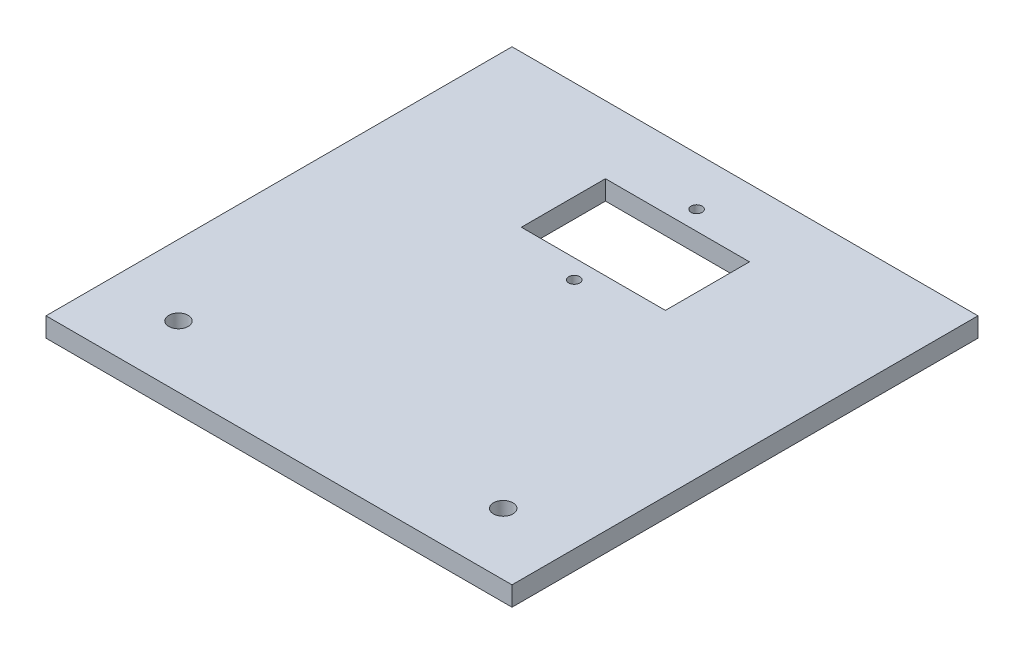
ISO-10303-21;
HEADER;
FILE_DESCRIPTION(('STEP AP214'),'2;1');
FILE_NAME('part.step','',(''),(''),'','','');
FILE_SCHEMA(('AUTOMOTIVE_DESIGN { 1 0 10303 214 1 1 1 1 }'));
ENDSEC;
DATA;
#1=APPLICATION_CONTEXT('core data for automotive mechanical design processes');
#2=APPLICATION_PROTOCOL_DEFINITION('international standard','automotive_design',2000,#1);
#3=PRODUCT_CONTEXT('',#1,'mechanical');
#4=PRODUCT('Part','Part','',(#3));
#5=PRODUCT_RELATED_PRODUCT_CATEGORY('part','',(#4));
#6=PRODUCT_DEFINITION_FORMATION('','',#4);
#7=PRODUCT_DEFINITION_CONTEXT('part definition',#1,'design');
#8=PRODUCT_DEFINITION('design','',#6,#7);
#9=PRODUCT_DEFINITION_SHAPE('','',#8);
#10=(LENGTH_UNIT() NAMED_UNIT(*) SI_UNIT(.MILLI.,.METRE.));
#11=(NAMED_UNIT(*) PLANE_ANGLE_UNIT() SI_UNIT($,.RADIAN.));
#12=(NAMED_UNIT(*) SI_UNIT($,.STERADIAN.) SOLID_ANGLE_UNIT());
#13=UNCERTAINTY_MEASURE_WITH_UNIT(LENGTH_MEASURE(1.E-05),#10,'distance_accuracy_value','');
#14=(GEOMETRIC_REPRESENTATION_CONTEXT(3) GLOBAL_UNCERTAINTY_ASSIGNED_CONTEXT((#13)) GLOBAL_UNIT_ASSIGNED_CONTEXT((#10,
#11,#12)) REPRESENTATION_CONTEXT('',''));
#15=CARTESIAN_POINT('',(0.,0.,0.));
#16=DIRECTION('',(0.,0.,1.));
#17=DIRECTION('',(1.,0.,0.));
#18=AXIS2_PLACEMENT_3D('',#15,#16,#17);
#19=CARTESIAN_POINT('',(0.,3.175,0.));
#20=DIRECTION('',(0.,-1.,0.));
#21=DIRECTION('',(0.,0.,-1.));
#22=AXIS2_PLACEMENT_3D('',#19,#20,#21);
#23=PLANE('',#22);
#24=CARTESIAN_POINT('',(-53.096867931118,3.175,55.9809871297665));
#25=DIRECTION('',(0.,-1.,0.));
#26=DIRECTION('',(0.,0.,-1.));
#27=AXIS2_PLACEMENT_3D('',#24,#25,#26);
#28=CIRCLE('',#27,3.17500000000003);
#29=CARTESIAN_POINT('',(-53.096867931118,3.175,52.8059871297664));
#30=VERTEX_POINT('',#29);
#31=EDGE_CURVE('E226',#30,#30,#28,.T.);
#32=ORIENTED_EDGE('',*,*,#31,.T.);
#33=EDGE_LOOP('',(#32));
#34=FACE_BOUND('',#33,.T.);
#35=CARTESIAN_POINT('',(53.096867931118,3.175,55.9809871297665));
#36=DIRECTION('',(0.,-1.,0.));
#37=DIRECTION('',(0.,0.,-1.));
#38=AXIS2_PLACEMENT_3D('',#35,#36,#37);
#39=CIRCLE('',#38,3.17500000000003);
#40=CARTESIAN_POINT('',(53.096867931118,3.175,52.8059871297664));
#41=VERTEX_POINT('',#40);
#42=EDGE_CURVE('E216',#41,#41,#39,.T.);
#43=ORIENTED_EDGE('',*,*,#42,.T.);
#44=EDGE_LOOP('',(#43));
#45=FACE_BOUND('',#44,.T.);
#46=CARTESIAN_POINT('',(0.,3.175,-60.3611469920994));
#47=DIRECTION('',(0.,1.,0.));
#48=DIRECTION('',(0.,0.,1.));
#49=AXIS2_PLACEMENT_3D('',#46,#47,#48);
#50=CIRCLE('',#49,1.8);
#51=CARTESIAN_POINT('',(0.,3.175,-58.5611469920994));
#52=VERTEX_POINT('',#51);
#53=EDGE_CURVE('E137',#52,#52,#50,.T.);
#54=ORIENTED_EDGE('',*,*,#53,.F.);
#55=EDGE_LOOP('',(#54));
#56=FACE_BOUND('',#55,.T.);
#57=DIRECTION('',(0.,0.,-1.));
#58=VECTOR('',#57,1.);
#59=CARTESIAN_POINT('',(76.2,3.175,76.2));
#60=LINE('',#59,#58);
#61=CARTESIAN_POINT('',(76.2,3.175,76.2));
#62=VERTEX_POINT('',#61);
#63=CARTESIAN_POINT('',(76.2,3.175,-76.2));
#64=VERTEX_POINT('',#63);
#65=EDGE_CURVE('E156',#62,#64,#60,.T.);
#66=ORIENTED_EDGE('',*,*,#65,.T.);
#67=DIRECTION('',(-1.,0.,0.));
#68=VECTOR('',#67,1.);
#69=CARTESIAN_POINT('',(-76.2,3.175,-76.2));
#70=LINE('',#69,#68);
#71=CARTESIAN_POINT('',(-76.2,3.175,-76.2));
#72=VERTEX_POINT('',#71);
#73=EDGE_CURVE('E160',#64,#72,#70,.T.);
#74=ORIENTED_EDGE('',*,*,#73,.T.);
#75=DIRECTION('',(0.,0.,1.));
#76=VECTOR('',#75,1.);
#77=CARTESIAN_POINT('',(-76.2,3.175,76.2));
#78=LINE('',#77,#76);
#79=CARTESIAN_POINT('',(-76.2,3.175,76.2));
#80=VERTEX_POINT('',#79);
#81=EDGE_CURVE('E164',#72,#80,#78,.T.);
#82=ORIENTED_EDGE('',*,*,#81,.T.);
#83=DIRECTION('',(1.,0.,0.));
#84=VECTOR('',#83,1.);
#85=CARTESIAN_POINT('',(-76.2,3.175,76.2));
#86=LINE('',#85,#84);
#87=EDGE_CURVE('E167',#80,#62,#86,.T.);
#88=ORIENTED_EDGE('',*,*,#87,.T.);
#89=EDGE_LOOP('',(#66,#74,#82,#88));
#90=FACE_BOUND('',#89,.T.);
#91=DIRECTION('',(-1.,0.,0.));
#92=VECTOR('',#91,1.);
#93=CARTESIAN_POINT('',(23.55,3.175,-26.6111469920994));
#94=LINE('',#93,#92);
#95=CARTESIAN_POINT('',(23.55,3.175,-26.6111469920994));
#96=VERTEX_POINT('',#95);
#97=CARTESIAN_POINT('',(-23.55,3.175,-26.6111469920994));
#98=VERTEX_POINT('',#97);
#99=EDGE_CURVE('E65',#96,#98,#94,.T.);
#100=ORIENTED_EDGE('',*,*,#99,.T.);
#101=DIRECTION('',(0.,0.,1.));
#102=VECTOR('',#101,1.);
#103=CARTESIAN_POINT('',(-23.55,3.175,-54.1111469920994));
#104=LINE('',#103,#102);
#105=CARTESIAN_POINT('',(-23.55,3.175,-54.1111469920994));
#106=VERTEX_POINT('',#105);
#107=EDGE_CURVE('E124',#106,#98,#104,.T.);
#108=ORIENTED_EDGE('',*,*,#107,.F.);
#109=DIRECTION('',(-1.,0.,0.));
#110=VECTOR('',#109,1.);
#111=CARTESIAN_POINT('',(23.55,3.175,-54.1111469920994));
#112=LINE('',#111,#110);
#113=CARTESIAN_POINT('',(23.55,3.175,-54.1111469920994));
#114=VERTEX_POINT('',#113);
#115=EDGE_CURVE('E131',#114,#106,#112,.T.);
#116=ORIENTED_EDGE('',*,*,#115,.F.);
#117=DIRECTION('',(0.,0.,1.));
#118=VECTOR('',#117,1.);
#119=CARTESIAN_POINT('',(23.55,3.175,-54.1111469920994));
#120=LINE('',#119,#118);
#121=EDGE_CURVE('E135',#114,#96,#120,.T.);
#122=ORIENTED_EDGE('',*,*,#121,.T.);
#123=EDGE_LOOP('',(#100,#108,#116,#122));
#124=FACE_BOUND('',#123,.T.);
#125=CARTESIAN_POINT('',(0.,3.175,-20.3611469920994));
#126=DIRECTION('',(0.,-1.,0.));
#127=DIRECTION('',(0.,0.,-1.));
#128=AXIS2_PLACEMENT_3D('',#125,#126,#127);
#129=CIRCLE('',#128,1.8);
#130=CARTESIAN_POINT('',(0.,3.175,-22.1611469920994));
#131=VERTEX_POINT('',#130);
#132=EDGE_CURVE('E141',#131,#131,#129,.T.);
#133=ORIENTED_EDGE('',*,*,#132,.T.);
#134=EDGE_LOOP('',(#133));
#135=FACE_BOUND('',#134,.T.);
#136=ADVANCED_FACE('F47',(#34,#45,#56,#90,#124,#135),#23,.F.);
#137=CARTESIAN_POINT('',(0.,-3.175,0.));
#138=DIRECTION('',(0.,-1.,0.));
#139=DIRECTION('',(0.,0.,-1.));
#140=AXIS2_PLACEMENT_3D('',#137,#138,#139);
#141=PLANE('',#140);
#142=CARTESIAN_POINT('',(-53.096867931118,-3.175,55.9809871297665));
#143=DIRECTION('',(0.,-1.,0.));
#144=DIRECTION('',(0.,0.,-1.));
#145=AXIS2_PLACEMENT_3D('',#142,#143,#144);
#146=CIRCLE('',#145,3.17500000000003);
#147=CARTESIAN_POINT('',(-53.096867931118,-3.175,52.8059871297664));
#148=VERTEX_POINT('',#147);
#149=EDGE_CURVE('E51',#148,#148,#146,.T.);
#150=ORIENTED_EDGE('',*,*,#149,.F.);
#151=EDGE_LOOP('',(#150));
#152=FACE_BOUND('',#151,.T.);
#153=CARTESIAN_POINT('',(53.096867931118,-3.175,55.9809871297665));
#154=DIRECTION('',(0.,-1.,0.));
#155=DIRECTION('',(0.,0.,-1.));
#156=AXIS2_PLACEMENT_3D('',#153,#154,#155);
#157=CIRCLE('',#156,3.17500000000003);
#158=CARTESIAN_POINT('',(53.096867931118,-3.175,52.8059871297664));
#159=VERTEX_POINT('',#158);
#160=EDGE_CURVE('E213',#159,#159,#157,.T.);
#161=ORIENTED_EDGE('',*,*,#160,.F.);
#162=EDGE_LOOP('',(#161));
#163=FACE_BOUND('',#162,.T.);
#164=DIRECTION('',(0.,0.,-1.));
#165=VECTOR('',#164,1.);
#166=CARTESIAN_POINT('',(-23.55,-3.175,0.));
#167=LINE('',#166,#165);
#168=CARTESIAN_POINT('',(-23.55,-3.175,-26.6111469920994));
#169=VERTEX_POINT('',#168);
#170=CARTESIAN_POINT('',(-23.55,-3.175,-54.1111469920994));
#171=VERTEX_POINT('',#170);
#172=EDGE_CURVE('E57',#169,#171,#167,.T.);
#173=ORIENTED_EDGE('',*,*,#172,.F.);
#174=DIRECTION('',(1.,0.,0.));
#175=VECTOR('',#174,1.);
#176=CARTESIAN_POINT('',(0.,-3.175,-26.6111469920994));
#177=LINE('',#176,#175);
#178=CARTESIAN_POINT('',(23.55,-3.175,-26.6111469920994));
#179=VERTEX_POINT('',#178);
#180=EDGE_CURVE('E11',#169,#179,#177,.T.);
#181=ORIENTED_EDGE('',*,*,#180,.T.);
#182=DIRECTION('',(0.,0.,-1.));
#183=VECTOR('',#182,1.);
#184=CARTESIAN_POINT('',(23.55,-3.175,0.));
#185=LINE('',#184,#183);
#186=CARTESIAN_POINT('',(23.55,-3.175,-54.1111469920994));
#187=VERTEX_POINT('',#186);
#188=EDGE_CURVE('E199',#179,#187,#185,.T.);
#189=ORIENTED_EDGE('',*,*,#188,.T.);
#190=DIRECTION('',(1.,0.,0.));
#191=VECTOR('',#190,1.);
#192=CARTESIAN_POINT('',(0.,-3.175,-54.1111469920994));
#193=LINE('',#192,#191);
#194=EDGE_CURVE('E203',#171,#187,#193,.T.);
#195=ORIENTED_EDGE('',*,*,#194,.F.);
#196=EDGE_LOOP('',(#173,#181,#189,#195));
#197=FACE_BOUND('',#196,.T.);
#198=DIRECTION('',(0.,0.,-1.));
#199=VECTOR('',#198,1.);
#200=CARTESIAN_POINT('',(76.2,-3.175,76.2));
#201=LINE('',#200,#199);
#202=CARTESIAN_POINT('',(76.2,-3.175,76.2));
#203=VERTEX_POINT('',#202);
#204=CARTESIAN_POINT('',(76.2,-3.175,-76.2));
#205=VERTEX_POINT('',#204);
#206=EDGE_CURVE('E171',#203,#205,#201,.T.);
#207=ORIENTED_EDGE('',*,*,#206,.F.);
#208=DIRECTION('',(1.,0.,0.));
#209=VECTOR('',#208,1.);
#210=CARTESIAN_POINT('',(-76.2,-3.175,76.2));
#211=LINE('',#210,#209);
#212=CARTESIAN_POINT('',(-76.2,-3.175,76.2));
#213=VERTEX_POINT('',#212);
#214=EDGE_CURVE('E161',#213,#203,#211,.T.);
#215=ORIENTED_EDGE('',*,*,#214,.F.);
#216=DIRECTION('',(0.,0.,1.));
#217=VECTOR('',#216,1.);
#218=CARTESIAN_POINT('',(-76.2,-3.175,76.2));
#219=LINE('',#218,#217);
#220=CARTESIAN_POINT('',(-76.2,-3.175,-76.2));
#221=VERTEX_POINT('',#220);
#222=EDGE_CURVE('E179',#221,#213,#219,.T.);
#223=ORIENTED_EDGE('',*,*,#222,.F.);
#224=DIRECTION('',(-1.,0.,0.));
#225=VECTOR('',#224,1.);
#226=CARTESIAN_POINT('',(-76.2,-3.175,-76.2));
#227=LINE('',#226,#225);
#228=EDGE_CURVE('E175',#205,#221,#227,.T.);
#229=ORIENTED_EDGE('',*,*,#228,.F.);
#230=EDGE_LOOP('',(#207,#215,#223,#229));
#231=FACE_BOUND('',#230,.T.);
#232=CARTESIAN_POINT('',(0.,-3.175,-60.3611469920994));
#233=DIRECTION('',(0.,-1.,0.));
#234=DIRECTION('',(0.,0.,-1.));
#235=AXIS2_PLACEMENT_3D('',#232,#233,#234);
#236=CIRCLE('',#235,1.8);
#237=CARTESIAN_POINT('',(0.,-3.175,-62.1611469920994));
#238=VERTEX_POINT('',#237);
#239=EDGE_CURVE('E120',#238,#238,#236,.T.);
#240=ORIENTED_EDGE('',*,*,#239,.F.);
#241=EDGE_LOOP('',(#240));
#242=FACE_BOUND('',#241,.T.);
#243=CARTESIAN_POINT('',(0.,-3.175,-20.3611469920994));
#244=DIRECTION('',(0.,-1.,0.));
#245=DIRECTION('',(0.,0.,-1.));
#246=AXIS2_PLACEMENT_3D('',#243,#244,#245);
#247=CIRCLE('',#246,1.8);
#248=CARTESIAN_POINT('',(0.,-3.175,-22.1611469920994));
#249=VERTEX_POINT('',#248);
#250=EDGE_CURVE('E176',#249,#249,#247,.F.);
#251=ORIENTED_EDGE('',*,*,#250,.T.);
#252=EDGE_LOOP('',(#251));
#253=FACE_BOUND('',#252,.T.);
#254=ADVANCED_FACE('F254',(#152,#163,#197,#231,#242,#253),#141,.T.);
#255=CARTESIAN_POINT('',(76.2,3.175,76.2));
#256=DIRECTION('',(-1.,0.,0.));
#257=DIRECTION('',(0.,0.,1.));
#258=AXIS2_PLACEMENT_3D('',#255,#256,#257);
#259=PLANE('',#258);
#260=ORIENTED_EDGE('',*,*,#206,.T.);
#261=DIRECTION('',(0.,-1.,0.));
#262=VECTOR('',#261,1.);
#263=CARTESIAN_POINT('',(76.2,3.175,-76.2));
#264=LINE('',#263,#262);
#265=EDGE_CURVE('E195',#64,#205,#264,.T.);
#266=ORIENTED_EDGE('',*,*,#265,.F.);
#267=ORIENTED_EDGE('',*,*,#65,.F.);
#268=DIRECTION('',(0.,-1.,0.));
#269=VECTOR('',#268,1.);
#270=CARTESIAN_POINT('',(76.2,3.175,76.2));
#271=LINE('',#270,#269);
#272=EDGE_CURVE('E170',#62,#203,#271,.T.);
#273=ORIENTED_EDGE('',*,*,#272,.T.);
#274=EDGE_LOOP('',(#260,#266,#267,#273));
#275=FACE_BOUND('',#274,.T.);
#276=ADVANCED_FACE('F49',(#275),#259,.F.);
#277=CARTESIAN_POINT('',(-76.2,3.175,-76.2));
#278=DIRECTION('',(0.,0.,1.));
#279=DIRECTION('',(1.,0.,0.));
#280=AXIS2_PLACEMENT_3D('',#277,#278,#279);
#281=PLANE('',#280);
#282=ORIENTED_EDGE('',*,*,#228,.T.);
#283=DIRECTION('',(0.,-1.,0.));
#284=VECTOR('',#283,1.);
#285=CARTESIAN_POINT('',(-76.2,3.175,-76.2));
#286=LINE('',#285,#284);
#287=EDGE_CURVE('E191',#72,#221,#286,.T.);
#288=ORIENTED_EDGE('',*,*,#287,.F.);
#289=ORIENTED_EDGE('',*,*,#73,.F.);
#290=ORIENTED_EDGE('',*,*,#265,.T.);
#291=EDGE_LOOP('',(#282,#288,#289,#290));
#292=FACE_BOUND('',#291,.T.);
#293=ADVANCED_FACE('F270',(#292),#281,.F.);
#294=CARTESIAN_POINT('',(-76.2,3.175,76.2));
#295=DIRECTION('',(1.,0.,0.));
#296=DIRECTION('',(0.,0.,-1.));
#297=AXIS2_PLACEMENT_3D('',#294,#295,#296);
#298=PLANE('',#297);
#299=ORIENTED_EDGE('',*,*,#222,.T.);
#300=DIRECTION('',(0.,-1.,0.));
#301=VECTOR('',#300,1.);
#302=CARTESIAN_POINT('',(-76.2,3.175,76.2));
#303=LINE('',#302,#301);
#304=EDGE_CURVE('E187',#80,#213,#303,.T.);
#305=ORIENTED_EDGE('',*,*,#304,.F.);
#306=ORIENTED_EDGE('',*,*,#81,.F.);
#307=ORIENTED_EDGE('',*,*,#287,.T.);
#308=EDGE_LOOP('',(#299,#305,#306,#307));
#309=FACE_BOUND('',#308,.T.);
#310=ADVANCED_FACE('F267',(#309),#298,.F.);
#311=CARTESIAN_POINT('',(-76.2,3.175,76.2));
#312=DIRECTION('',(0.,0.,-1.));
#313=DIRECTION('',(-1.,0.,0.));
#314=AXIS2_PLACEMENT_3D('',#311,#312,#313);
#315=PLANE('',#314);
#316=ORIENTED_EDGE('',*,*,#214,.T.);
#317=ORIENTED_EDGE('',*,*,#272,.F.);
#318=ORIENTED_EDGE('',*,*,#87,.F.);
#319=ORIENTED_EDGE('',*,*,#304,.T.);
#320=EDGE_LOOP('',(#316,#317,#318,#319));
#321=FACE_BOUND('',#320,.T.);
#322=ADVANCED_FACE('F264',(#321),#315,.F.);
#323=CARTESIAN_POINT('',(23.55,-6.825,-26.6111469920994));
#324=DIRECTION('',(0.,0.,-1.));
#325=DIRECTION('',(-1.,0.,0.));
#326=AXIS2_PLACEMENT_3D('',#323,#324,#325);
#327=PLANE('',#326);
#328=DIRECTION('',(0.,1.,0.));
#329=VECTOR('',#328,1.);
#330=CARTESIAN_POINT('',(-23.55,-6.825,-26.6111469920994));
#331=LINE('',#330,#329);
#332=EDGE_CURVE('E114',#169,#98,#331,.T.);
#333=ORIENTED_EDGE('',*,*,#332,.T.);
#334=ORIENTED_EDGE('',*,*,#99,.F.);
#335=DIRECTION('',(0.,1.,0.));
#336=VECTOR('',#335,1.);
#337=CARTESIAN_POINT('',(23.55,-6.825,-26.6111469920994));
#338=LINE('',#337,#336);
#339=EDGE_CURVE('E149',#179,#96,#338,.T.);
#340=ORIENTED_EDGE('',*,*,#339,.F.);
#341=ORIENTED_EDGE('',*,*,#180,.F.);
#342=EDGE_LOOP('',(#333,#334,#340,#341));
#343=FACE_BOUND('',#342,.T.);
#344=ADVANCED_FACE('F116',(#343),#327,.T.);
#345=CARTESIAN_POINT('',(-23.55,-6.825,-54.1111469920994));
#346=DIRECTION('',(-1.,0.,0.));
#347=DIRECTION('',(0.,0.,1.));
#348=AXIS2_PLACEMENT_3D('',#345,#346,#347);
#349=PLANE('',#348);
#350=ORIENTED_EDGE('',*,*,#172,.T.);
#351=DIRECTION('',(0.,1.,0.));
#352=VECTOR('',#351,1.);
#353=CARTESIAN_POINT('',(-23.55,-6.825,-54.1111469920994));
#354=LINE('',#353,#352);
#355=EDGE_CURVE('E121',#171,#106,#354,.T.);
#356=ORIENTED_EDGE('',*,*,#355,.T.);
#357=ORIENTED_EDGE('',*,*,#107,.T.);
#358=ORIENTED_EDGE('',*,*,#332,.F.);
#359=EDGE_LOOP('',(#350,#356,#357,#358));
#360=FACE_BOUND('',#359,.T.);
#361=ADVANCED_FACE('F125',(#360),#349,.F.);
#362=CARTESIAN_POINT('',(23.55,-6.825,-54.1111469920994));
#363=DIRECTION('',(0.,0.,-1.));
#364=DIRECTION('',(-1.,0.,0.));
#365=AXIS2_PLACEMENT_3D('',#362,#363,#364);
#366=PLANE('',#365);
#367=ORIENTED_EDGE('',*,*,#194,.T.);
#368=DIRECTION('',(0.,1.,0.));
#369=VECTOR('',#368,1.);
#370=CARTESIAN_POINT('',(23.55,-6.825,-54.1111469920994));
#371=LINE('',#370,#369);
#372=EDGE_CURVE('E73',#187,#114,#371,.T.);
#373=ORIENTED_EDGE('',*,*,#372,.T.);
#374=ORIENTED_EDGE('',*,*,#115,.T.);
#375=ORIENTED_EDGE('',*,*,#355,.F.);
#376=EDGE_LOOP('',(#367,#373,#374,#375));
#377=FACE_BOUND('',#376,.T.);
#378=ADVANCED_FACE('F331',(#377),#366,.F.);
#379=CARTESIAN_POINT('',(23.55,-6.825,-54.1111469920994));
#380=DIRECTION('',(-1.,0.,0.));
#381=DIRECTION('',(0.,0.,1.));
#382=AXIS2_PLACEMENT_3D('',#379,#380,#381);
#383=PLANE('',#382);
#384=ORIENTED_EDGE('',*,*,#339,.T.);
#385=ORIENTED_EDGE('',*,*,#121,.F.);
#386=ORIENTED_EDGE('',*,*,#372,.F.);
#387=ORIENTED_EDGE('',*,*,#188,.F.);
#388=EDGE_LOOP('',(#384,#385,#386,#387));
#389=FACE_BOUND('',#388,.T.);
#390=ADVANCED_FACE('F249',(#389),#383,.T.);
#391=CARTESIAN_POINT('',(0.,-6.825,-60.3611469920994));
#392=DIRECTION('',(0.,1.,0.));
#393=DIRECTION('',(0.,0.,1.));
#394=AXIS2_PLACEMENT_3D('',#391,#392,#393);
#395=CYLINDRICAL_SURFACE('',#394,1.8);
#396=ORIENTED_EDGE('',*,*,#239,.T.);
#397=EDGE_LOOP('',(#396));
#398=FACE_BOUND('',#397,.T.);
#399=ORIENTED_EDGE('',*,*,#53,.T.);
#400=EDGE_LOOP('',(#399));
#401=FACE_BOUND('',#400,.T.);
#402=ADVANCED_FACE('F239',(#398,#401),#395,.F.);
#403=CARTESIAN_POINT('',(0.,-6.825,-20.3611469920994));
#404=DIRECTION('',(0.,1.,0.));
#405=DIRECTION('',(0.,0.,1.));
#406=AXIS2_PLACEMENT_3D('',#403,#404,#405);
#407=CYLINDRICAL_SURFACE('',#406,1.8);
#408=ORIENTED_EDGE('',*,*,#250,.F.);
#409=EDGE_LOOP('',(#408));
#410=FACE_BOUND('',#409,.T.);
#411=ORIENTED_EDGE('',*,*,#132,.F.);
#412=EDGE_LOOP('',(#411));
#413=FACE_BOUND('',#412,.T.);
#414=ADVANCED_FACE('F236',(#410,#413),#407,.F.);
#415=CARTESIAN_POINT('',(53.096867931118,-5.,55.9809871297665));
#416=DIRECTION('',(0.,1.,0.));
#417=DIRECTION('',(0.,0.,1.));
#418=AXIS2_PLACEMENT_3D('',#415,#416,#417);
#419=CYLINDRICAL_SURFACE('',#418,3.17500000000003);
#420=ORIENTED_EDGE('',*,*,#160,.T.);
#421=EDGE_LOOP('',(#420));
#422=FACE_BOUND('',#421,.T.);
#423=ORIENTED_EDGE('',*,*,#42,.F.);
#424=EDGE_LOOP('',(#423));
#425=FACE_BOUND('',#424,.T.);
#426=ADVANCED_FACE('F238',(#422,#425),#419,.F.);
#427=CARTESIAN_POINT('',(-53.096867931118,-5.,55.9809871297665));
#428=DIRECTION('',(0.,1.,0.));
#429=DIRECTION('',(0.,0.,1.));
#430=AXIS2_PLACEMENT_3D('',#427,#428,#429);
#431=CYLINDRICAL_SURFACE('',#430,3.17500000000003);
#432=ORIENTED_EDGE('',*,*,#149,.T.);
#433=EDGE_LOOP('',(#432));
#434=FACE_BOUND('',#433,.T.);
#435=ORIENTED_EDGE('',*,*,#31,.F.);
#436=EDGE_LOOP('',(#435));
#437=FACE_BOUND('',#436,.T.);
#438=ADVANCED_FACE('F247',(#434,#437),#431,.F.);
#439=CLOSED_SHELL('',(#136,#254,#276,#293,#310,#322,#344,#361,#378,#390,#402,#414,#426,#438));
#440=MANIFOLD_SOLID_BREP('B2',#439);
#441=ADVANCED_BREP_SHAPE_REPRESENTATION('',(#18,#440),#14);
#442=SHAPE_DEFINITION_REPRESENTATION(#9,#441);
ENDSEC;
END-ISO-10303-21;
